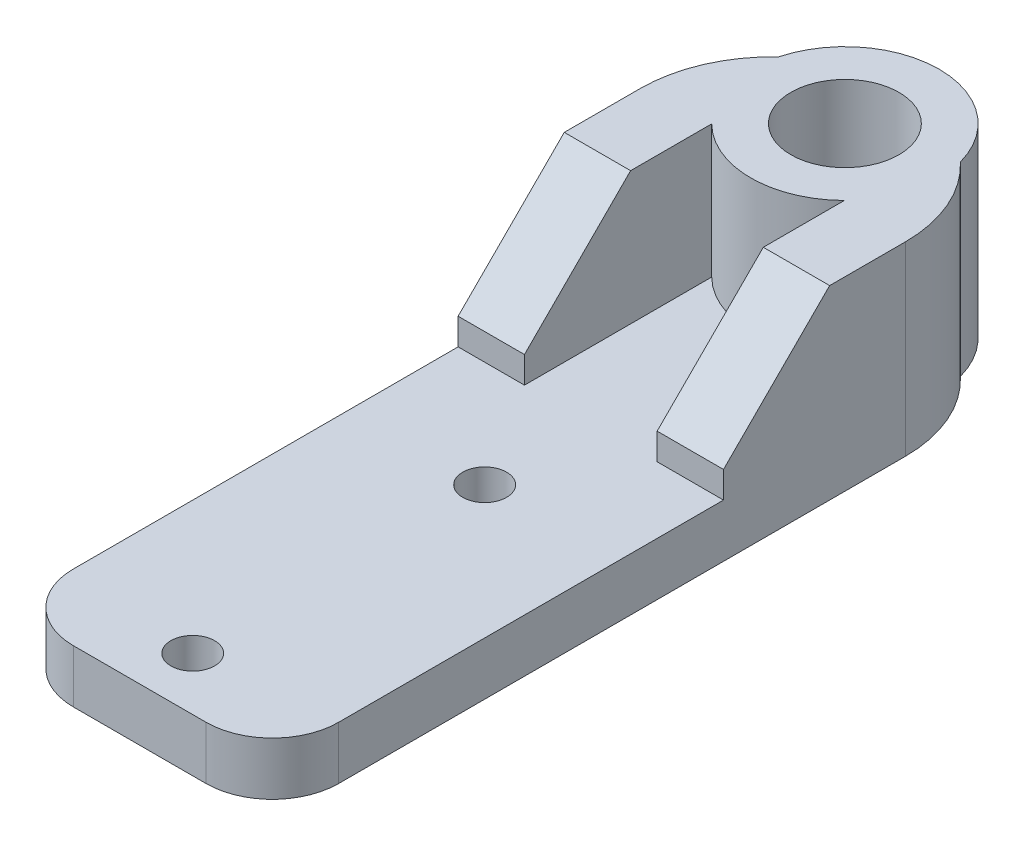
ISO-10303-21;
HEADER;
FILE_DESCRIPTION(('STEP AP214'),'2;1');
FILE_NAME('part.step','',(''),(''),'','','');
FILE_SCHEMA(('AUTOMOTIVE_DESIGN { 1 0 10303 214 1 1 1 1 }'));
ENDSEC;
DATA;
#1=APPLICATION_CONTEXT('core data for automotive mechanical design processes');
#2=APPLICATION_PROTOCOL_DEFINITION('international standard','automotive_design',2000,#1);
#3=PRODUCT_CONTEXT('',#1,'mechanical');
#4=PRODUCT('Part','Part','',(#3));
#5=PRODUCT_RELATED_PRODUCT_CATEGORY('part','',(#4));
#6=PRODUCT_DEFINITION_FORMATION('','',#4);
#7=PRODUCT_DEFINITION_CONTEXT('part definition',#1,'design');
#8=PRODUCT_DEFINITION('design','',#6,#7);
#9=PRODUCT_DEFINITION_SHAPE('','',#8);
#10=(LENGTH_UNIT() NAMED_UNIT(*) SI_UNIT(.MILLI.,.METRE.));
#11=(NAMED_UNIT(*) PLANE_ANGLE_UNIT() SI_UNIT($,.RADIAN.));
#12=(NAMED_UNIT(*) SI_UNIT($,.STERADIAN.) SOLID_ANGLE_UNIT());
#13=UNCERTAINTY_MEASURE_WITH_UNIT(LENGTH_MEASURE(1.E-05),#10,'distance_accuracy_value','');
#14=(GEOMETRIC_REPRESENTATION_CONTEXT(3) GLOBAL_UNCERTAINTY_ASSIGNED_CONTEXT((#13)) GLOBAL_UNIT_ASSIGNED_CONTEXT((#10,
#11,#12)) REPRESENTATION_CONTEXT('',''));
#15=CARTESIAN_POINT('',(0.,0.,0.));
#16=DIRECTION('',(0.,0.,1.));
#17=DIRECTION('',(1.,0.,0.));
#18=AXIS2_PLACEMENT_3D('',#15,#16,#17);
#19=CARTESIAN_POINT('',(0.,4.,0.));
#20=DIRECTION('',(0.,-1.,0.));
#21=DIRECTION('',(0.,0.,-1.));
#22=AXIS2_PLACEMENT_3D('',#19,#20,#21);
#23=PLANE('',#22);
#24=CARTESIAN_POINT('',(0.,4.,23.5));
#25=DIRECTION('',(0.,1.,0.));
#26=DIRECTION('',(0.,0.,1.));
#27=AXIS2_PLACEMENT_3D('',#24,#25,#26);
#28=CIRCLE('',#27,1.65);
#29=CARTESIAN_POINT('',(0.,4.,25.15));
#30=VERTEX_POINT('',#29);
#31=EDGE_CURVE('E334',#30,#30,#28,.T.);
#32=ORIENTED_EDGE('',*,*,#31,.F.);
#33=EDGE_LOOP('',(#32));
#34=FACE_BOUND('',#33,.T.);
#35=CARTESIAN_POINT('',(0.,4.,1.5));
#36=DIRECTION('',(0.,1.,0.));
#37=DIRECTION('',(0.,0.,1.));
#38=AXIS2_PLACEMENT_3D('',#35,#36,#37);
#39=CIRCLE('',#38,1.65);
#40=CARTESIAN_POINT('',(0.,4.,3.15));
#41=VERTEX_POINT('',#40);
#42=EDGE_CURVE('E328',#41,#41,#39,.T.);
#43=ORIENTED_EDGE('',*,*,#42,.F.);
#44=EDGE_LOOP('',(#43));
#45=FACE_BOUND('',#44,.T.);
#46=DIRECTION('',(1.,0.,0.));
#47=VECTOR('',#46,1.);
#48=CARTESIAN_POINT('',(-10.,4.,27.5));
#49=LINE('',#48,#47);
#50=CARTESIAN_POINT('',(-5.,4.,27.5));
#51=VERTEX_POINT('',#50);
#52=CARTESIAN_POINT('',(5.,4.,27.5));
#53=VERTEX_POINT('',#52);
#54=EDGE_CURVE('E205',#51,#53,#49,.T.);
#55=ORIENTED_EDGE('',*,*,#54,.T.);
#56=CARTESIAN_POINT('',(5.,4.,22.5));
#57=DIRECTION('',(0.,-1.,0.));
#58=DIRECTION('',(0.,0.,-1.));
#59=AXIS2_PLACEMENT_3D('',#56,#57,#58);
#60=CIRCLE('',#59,5.);
#61=CARTESIAN_POINT('',(10.,4.,22.5));
#62=VERTEX_POINT('',#61);
#63=EDGE_CURVE('E46',#53,#62,#60,.F.);
#64=ORIENTED_EDGE('',*,*,#63,.T.);
#65=DIRECTION('',(0.,0.,-1.));
#66=VECTOR('',#65,1.);
#67=CARTESIAN_POINT('',(10.,4.,27.5));
#68=LINE('',#67,#66);
#69=CARTESIAN_POINT('',(10.,4.,-6.5));
#70=VERTEX_POINT('',#69);
#71=EDGE_CURVE('E200',#62,#70,#68,.T.);
#72=ORIENTED_EDGE('',*,*,#71,.T.);
#73=DIRECTION('',(-1.,0.,0.));
#74=VECTOR('',#73,1.);
#75=CARTESIAN_POINT('',(0.,4.,-6.5));
#76=LINE('',#75,#74);
#77=CARTESIAN_POINT('',(5.,4.,-6.5));
#78=VERTEX_POINT('',#77);
#79=EDGE_CURVE('E185',#70,#78,#76,.T.);
#80=ORIENTED_EDGE('',*,*,#79,.T.);
#81=DIRECTION('',(0.,0.,1.));
#82=VECTOR('',#81,1.);
#83=CARTESIAN_POINT('',(5.,4.,0.));
#84=LINE('',#83,#82);
#85=CARTESIAN_POINT('',(5.,4.,-20.6091667355486));
#86=VERTEX_POINT('',#85);
#87=EDGE_CURVE('E311',#86,#78,#84,.T.);
#88=ORIENTED_EDGE('',*,*,#87,.F.);
#89=CARTESIAN_POINT('',(0.,4.,-25.65));
#90=DIRECTION('',(0.,-1.,0.));
#91=DIRECTION('',(0.,0.,-1.));
#92=AXIS2_PLACEMENT_3D('',#89,#90,#91);
#93=CIRCLE('',#92,7.1);
#94=CARTESIAN_POINT('',(-5.,4.,-20.6091667355486));
#95=VERTEX_POINT('',#94);
#96=EDGE_CURVE('E191',#86,#95,#93,.T.);
#97=ORIENTED_EDGE('',*,*,#96,.T.);
#98=DIRECTION('',(0.,0.,-1.));
#99=VECTOR('',#98,1.);
#100=CARTESIAN_POINT('',(-5.,4.,0.));
#101=LINE('',#100,#99);
#102=CARTESIAN_POINT('',(-5.,4.,-6.5));
#103=VERTEX_POINT('',#102);
#104=EDGE_CURVE('E159',#103,#95,#101,.T.);
#105=ORIENTED_EDGE('',*,*,#104,.F.);
#106=DIRECTION('',(1.,0.,0.));
#107=VECTOR('',#106,1.);
#108=CARTESIAN_POINT('',(0.,4.,-6.5));
#109=LINE('',#108,#107);
#110=CARTESIAN_POINT('',(-10.,4.,-6.5));
#111=VERTEX_POINT('',#110);
#112=EDGE_CURVE('E300',#111,#103,#109,.T.);
#113=ORIENTED_EDGE('',*,*,#112,.F.);
#114=DIRECTION('',(0.,0.,1.));
#115=VECTOR('',#114,1.);
#116=CARTESIAN_POINT('',(-10.,4.,27.5));
#117=LINE('',#116,#115);
#118=CARTESIAN_POINT('',(-10.,4.,22.5));
#119=VERTEX_POINT('',#118);
#120=EDGE_CURVE('E202',#111,#119,#117,.T.);
#121=ORIENTED_EDGE('',*,*,#120,.T.);
#122=CARTESIAN_POINT('',(-5.,4.,22.5));
#123=DIRECTION('',(0.,-1.,0.));
#124=DIRECTION('',(0.,0.,-1.));
#125=AXIS2_PLACEMENT_3D('',#122,#123,#124);
#126=CIRCLE('',#125,5.);
#127=EDGE_CURVE('E257',#119,#51,#126,.F.);
#128=ORIENTED_EDGE('',*,*,#127,.T.);
#129=EDGE_LOOP('',(#55,#64,#72,#80,#88,#97,#105,#113,#121,#128));
#130=FACE_BOUND('',#129,.T.);
#131=ADVANCED_FACE('F38',(#34,#45,#130),#23,.F.);
#132=CARTESIAN_POINT('',(0.,-20.081832585698,-25.65));
#133=DIRECTION('',(0.,1.,0.));
#134=DIRECTION('',(0.,0.,1.));
#135=AXIS2_PLACEMENT_3D('',#132,#133,#134);
#136=CYLINDRICAL_SURFACE('',#135,7.1);
#137=DIRECTION('',(0.,1.,0.));
#138=VECTOR('',#137,1.);
#139=CARTESIAN_POINT('',(-6.85474288358068,-20.081832585698,-27.5));
#140=LINE('',#139,#138);
#141=CARTESIAN_POINT('',(-6.85474288358068,14.,-27.5));
#142=VERTEX_POINT('',#141);
#143=CARTESIAN_POINT('',(-6.85474288358068,0.,-27.5));
#144=VERTEX_POINT('',#143);
#145=EDGE_CURVE('E193',#142,#144,#140,.F.);
#146=ORIENTED_EDGE('',*,*,#145,.F.);
#147=CARTESIAN_POINT('',(0.,14.,-25.65));
#148=DIRECTION('',(0.,1.,0.));
#149=DIRECTION('',(0.,0.,1.));
#150=AXIS2_PLACEMENT_3D('',#147,#148,#149);
#151=CIRCLE('',#150,7.1);
#152=CARTESIAN_POINT('',(6.85474288358068,14.,-27.5));
#153=VERTEX_POINT('',#152);
#154=EDGE_CURVE('E179',#153,#142,#151,.T.);
#155=ORIENTED_EDGE('',*,*,#154,.F.);
#156=DIRECTION('',(0.,1.,0.));
#157=VECTOR('',#156,1.);
#158=CARTESIAN_POINT('',(6.85474288358068,-20.081832585698,-27.5));
#159=LINE('',#158,#157);
#160=CARTESIAN_POINT('',(6.85474288358068,0.,-27.5));
#161=VERTEX_POINT('',#160);
#162=EDGE_CURVE('E196',#161,#153,#159,.T.);
#163=ORIENTED_EDGE('',*,*,#162,.F.);
#164=CARTESIAN_POINT('',(0.,0.,-25.65));
#165=DIRECTION('',(0.,-1.,0.));
#166=DIRECTION('',(0.,0.,-1.));
#167=AXIS2_PLACEMENT_3D('',#164,#165,#166);
#168=CIRCLE('',#167,7.1);
#169=EDGE_CURVE('E183',#161,#144,#168,.F.);
#170=ORIENTED_EDGE('',*,*,#169,.T.);
#171=EDGE_LOOP('',(#146,#155,#163,#170));
#172=FACE_BOUND('',#171,.T.);
#173=ADVANCED_FACE('F291',(#172),#136,.T.);
#174=CARTESIAN_POINT('',(-5.,14.,-20.6091667355486));
#175=VERTEX_POINT('',#174);
#176=CARTESIAN_POINT('',(5.,14.,-20.6091667355486));
#177=VERTEX_POINT('',#176);
#178=EDGE_CURVE('E170',#175,#177,#151,.T.);
#179=ORIENTED_EDGE('',*,*,#178,.F.);
#180=DIRECTION('',(0.,1.,0.));
#181=VECTOR('',#180,1.);
#182=CARTESIAN_POINT('',(-5.,-20.081832585698,-20.6091667355486));
#183=LINE('',#182,#181);
#184=EDGE_CURVE('E153',#175,#95,#183,.F.);
#185=ORIENTED_EDGE('',*,*,#184,.T.);
#186=ORIENTED_EDGE('',*,*,#96,.F.);
#187=DIRECTION('',(0.,1.,0.));
#188=VECTOR('',#187,1.);
#189=CARTESIAN_POINT('',(5.,-20.081832585698,-20.6091667355486));
#190=LINE('',#189,#188);
#191=EDGE_CURVE('E178',#86,#177,#190,.T.);
#192=ORIENTED_EDGE('',*,*,#191,.T.);
#193=EDGE_LOOP('',(#179,#185,#186,#192));
#194=FACE_BOUND('',#193,.T.);
#195=ADVANCED_FACE('F177',(#194),#136,.T.);
#196=CARTESIAN_POINT('',(10.,4.,27.5));
#197=DIRECTION('',(-1.,0.,0.));
#198=DIRECTION('',(0.,0.,1.));
#199=AXIS2_PLACEMENT_3D('',#196,#197,#198);
#200=PLANE('',#199);
#201=ORIENTED_EDGE('',*,*,#71,.F.);
#202=DIRECTION('',(0.,-1.,0.));
#203=VECTOR('',#202,1.);
#204=CARTESIAN_POINT('',(10.,4.,22.5));
#205=LINE('',#204,#203);
#206=CARTESIAN_POINT('',(10.,0.,22.5));
#207=VERTEX_POINT('',#206);
#208=EDGE_CURVE('E246',#62,#207,#205,.T.);
#209=ORIENTED_EDGE('',*,*,#208,.T.);
#210=DIRECTION('',(0.,0.,-1.));
#211=VECTOR('',#210,1.);
#212=CARTESIAN_POINT('',(10.,0.,27.5));
#213=LINE('',#212,#211);
#214=CARTESIAN_POINT('',(10.,0.,-20.2190316578081));
#215=VERTEX_POINT('',#214);
#216=EDGE_CURVE('E199',#207,#215,#213,.T.);
#217=ORIENTED_EDGE('',*,*,#216,.T.);
#218=DIRECTION('',(0.,1.,0.));
#219=VECTOR('',#218,1.);
#220=CARTESIAN_POINT('',(10.,4.,-20.2190316578081));
#221=LINE('',#220,#219);
#222=CARTESIAN_POINT('',(9.99999999999999,14.,-20.2190316578081));
#223=VERTEX_POINT('',#222);
#224=EDGE_CURVE('E237',#215,#223,#221,.T.);
#225=ORIENTED_EDGE('',*,*,#224,.T.);
#226=DIRECTION('',(0.,0.,1.));
#227=VECTOR('',#226,1.);
#228=CARTESIAN_POINT('',(10.,14.,-27.5));
#229=LINE('',#228,#227);
#230=CARTESIAN_POINT('',(10.,14.,-14.5));
#231=VERTEX_POINT('',#230);
#232=EDGE_CURVE('E297',#223,#231,#229,.T.);
#233=ORIENTED_EDGE('',*,*,#232,.T.);
#234=DIRECTION('',(0.,0.707106781186549,-0.707106781186546));
#235=VECTOR('',#234,1.);
#236=CARTESIAN_POINT('',(10.,14.,-14.5));
#237=LINE('',#236,#235);
#238=CARTESIAN_POINT('',(10.,5.99999999999997,-6.5));
#239=VERTEX_POINT('',#238);
#240=EDGE_CURVE('E217',#231,#239,#237,.F.);
#241=ORIENTED_EDGE('',*,*,#240,.T.);
#242=DIRECTION('',(0.,-1.,0.));
#243=VECTOR('',#242,1.);
#244=CARTESIAN_POINT('',(10.,0.,-6.5));
#245=LINE('',#244,#243);
#246=EDGE_CURVE('E269',#239,#70,#245,.T.);
#247=ORIENTED_EDGE('',*,*,#246,.T.);
#248=EDGE_LOOP('',(#201,#209,#217,#225,#233,#241,#247));
#249=FACE_BOUND('',#248,.T.);
#250=ADVANCED_FACE('F266',(#249),#200,.F.);
#251=CARTESIAN_POINT('',(-10.,4.,27.5));
#252=DIRECTION('',(1.,0.,0.));
#253=DIRECTION('',(0.,0.,-1.));
#254=AXIS2_PLACEMENT_3D('',#251,#252,#253);
#255=PLANE('',#254);
#256=DIRECTION('',(0.,0.,1.));
#257=VECTOR('',#256,1.);
#258=CARTESIAN_POINT('',(-10.,0.,27.5));
#259=LINE('',#258,#257);
#260=CARTESIAN_POINT('',(-10.,0.,-20.2190316578081));
#261=VERTEX_POINT('',#260);
#262=CARTESIAN_POINT('',(-10.,0.,22.5));
#263=VERTEX_POINT('',#262);
#264=EDGE_CURVE('E209',#261,#263,#259,.T.);
#265=ORIENTED_EDGE('',*,*,#264,.T.);
#266=DIRECTION('',(0.,-1.,0.));
#267=VECTOR('',#266,1.);
#268=CARTESIAN_POINT('',(-10.,4.,22.5));
#269=LINE('',#268,#267);
#270=EDGE_CURVE('E11',#263,#119,#269,.F.);
#271=ORIENTED_EDGE('',*,*,#270,.T.);
#272=ORIENTED_EDGE('',*,*,#120,.F.);
#273=DIRECTION('',(0.,-1.,0.));
#274=VECTOR('',#273,1.);
#275=CARTESIAN_POINT('',(-10.,0.,-6.5));
#276=LINE('',#275,#274);
#277=CARTESIAN_POINT('',(-10.,5.99999999999997,-6.5));
#278=VERTEX_POINT('',#277);
#279=EDGE_CURVE('E324',#278,#111,#276,.T.);
#280=ORIENTED_EDGE('',*,*,#279,.F.);
#281=DIRECTION('',(0.,0.707106781186549,-0.707106781186546));
#282=VECTOR('',#281,1.);
#283=CARTESIAN_POINT('',(-10.,5.99999999999997,-6.5));
#284=LINE('',#283,#282);
#285=CARTESIAN_POINT('',(-10.,14.,-14.5));
#286=VERTEX_POINT('',#285);
#287=EDGE_CURVE('E226',#278,#286,#284,.T.);
#288=ORIENTED_EDGE('',*,*,#287,.T.);
#289=DIRECTION('',(0.,0.,1.));
#290=VECTOR('',#289,1.);
#291=CARTESIAN_POINT('',(-10.,14.,-27.5));
#292=LINE('',#291,#290);
#293=CARTESIAN_POINT('',(-9.99999999999999,14.,-20.2190316578081));
#294=VERTEX_POINT('',#293);
#295=EDGE_CURVE('E284',#294,#286,#292,.T.);
#296=ORIENTED_EDGE('',*,*,#295,.F.);
#297=DIRECTION('',(0.,1.,0.));
#298=VECTOR('',#297,1.);
#299=CARTESIAN_POINT('',(-10.,4.,-20.2190316578081));
#300=LINE('',#299,#298);
#301=EDGE_CURVE('E243',#294,#261,#300,.F.);
#302=ORIENTED_EDGE('',*,*,#301,.T.);
#303=EDGE_LOOP('',(#265,#271,#272,#280,#288,#296,#302));
#304=FACE_BOUND('',#303,.T.);
#305=ADVANCED_FACE('F281',(#304),#255,.F.);
#306=CARTESIAN_POINT('',(-10.,4.,27.5));
#307=DIRECTION('',(0.,0.,-1.));
#308=DIRECTION('',(-1.,0.,0.));
#309=AXIS2_PLACEMENT_3D('',#306,#307,#308);
#310=PLANE('',#309);
#311=DIRECTION('',(1.,0.,0.));
#312=VECTOR('',#311,1.);
#313=CARTESIAN_POINT('',(-10.,0.,27.5));
#314=LINE('',#313,#312);
#315=CARTESIAN_POINT('',(-5.,0.,27.5));
#316=VERTEX_POINT('',#315);
#317=CARTESIAN_POINT('',(5.,0.,27.5));
#318=VERTEX_POINT('',#317);
#319=EDGE_CURVE('E203',#316,#318,#314,.T.);
#320=ORIENTED_EDGE('',*,*,#319,.T.);
#321=DIRECTION('',(0.,-1.,0.));
#322=VECTOR('',#321,1.);
#323=CARTESIAN_POINT('',(5.,4.,27.5));
#324=LINE('',#323,#322);
#325=EDGE_CURVE('E59',#318,#53,#324,.F.);
#326=ORIENTED_EDGE('',*,*,#325,.T.);
#327=ORIENTED_EDGE('',*,*,#54,.F.);
#328=DIRECTION('',(0.,-1.,0.));
#329=VECTOR('',#328,1.);
#330=CARTESIAN_POINT('',(-5.,4.,27.5));
#331=LINE('',#330,#329);
#332=EDGE_CURVE('E253',#51,#316,#331,.T.);
#333=ORIENTED_EDGE('',*,*,#332,.T.);
#334=EDGE_LOOP('',(#320,#326,#327,#333));
#335=FACE_BOUND('',#334,.T.);
#336=ADVANCED_FACE('F276',(#335),#310,.F.);
#337=CARTESIAN_POINT('',(0.,0.,0.));
#338=DIRECTION('',(0.,-1.,0.));
#339=DIRECTION('',(0.,0.,-1.));
#340=AXIS2_PLACEMENT_3D('',#337,#338,#339);
#341=PLANE('',#340);
#342=CARTESIAN_POINT('',(0.,0.,23.5));
#343=DIRECTION('',(0.,1.,0.));
#344=DIRECTION('',(0.,0.,1.));
#345=AXIS2_PLACEMENT_3D('',#342,#343,#344);
#346=CIRCLE('',#345,1.65);
#347=CARTESIAN_POINT('',(0.,0.,25.15));
#348=VERTEX_POINT('',#347);
#349=EDGE_CURVE('E325',#348,#348,#346,.T.);
#350=ORIENTED_EDGE('',*,*,#349,.T.);
#351=EDGE_LOOP('',(#350));
#352=FACE_BOUND('',#351,.T.);
#353=CARTESIAN_POINT('',(0.,0.,1.5));
#354=DIRECTION('',(0.,1.,0.));
#355=DIRECTION('',(0.,0.,1.));
#356=AXIS2_PLACEMENT_3D('',#353,#354,#355);
#357=CIRCLE('',#356,1.65);
#358=CARTESIAN_POINT('',(0.,0.,3.15));
#359=VERTEX_POINT('',#358);
#360=EDGE_CURVE('E331',#359,#359,#357,.T.);
#361=ORIENTED_EDGE('',*,*,#360,.T.);
#362=EDGE_LOOP('',(#361));
#363=FACE_BOUND('',#362,.T.);
#364=ORIENTED_EDGE('',*,*,#216,.F.);
#365=CARTESIAN_POINT('',(5.,0.,22.5));
#366=DIRECTION('',(0.,-1.,0.));
#367=DIRECTION('',(0.,0.,-1.));
#368=AXIS2_PLACEMENT_3D('',#365,#366,#367);
#369=CIRCLE('',#368,5.);
#370=EDGE_CURVE('E251',#207,#318,#369,.T.);
#371=ORIENTED_EDGE('',*,*,#370,.T.);
#372=ORIENTED_EDGE('',*,*,#319,.F.);
#373=CARTESIAN_POINT('',(-5.,0.,22.5));
#374=DIRECTION('',(0.,-1.,0.));
#375=DIRECTION('',(0.,0.,-1.));
#376=AXIS2_PLACEMENT_3D('',#373,#374,#375);
#377=CIRCLE('',#376,5.);
#378=EDGE_CURVE('E249',#316,#263,#377,.T.);
#379=ORIENTED_EDGE('',*,*,#378,.T.);
#380=ORIENTED_EDGE('',*,*,#264,.F.);
#381=CARTESIAN_POINT('',(0.,0.,-20.2190316578081));
#382=DIRECTION('',(0.,-1.,0.));
#383=DIRECTION('',(0.,0.,-1.));
#384=AXIS2_PLACEMENT_3D('',#381,#382,#383);
#385=CIRCLE('',#384,10.);
#386=EDGE_CURVE('E232',#261,#144,#385,.T.);
#387=ORIENTED_EDGE('',*,*,#386,.T.);
#388=ORIENTED_EDGE('',*,*,#169,.F.);
#389=CARTESIAN_POINT('',(0.,0.,-20.2190316578081));
#390=DIRECTION('',(0.,-1.,0.));
#391=DIRECTION('',(0.,0.,-1.));
#392=AXIS2_PLACEMENT_3D('',#389,#390,#391);
#393=CIRCLE('',#392,10.);
#394=EDGE_CURVE('E234',#161,#215,#393,.T.);
#395=ORIENTED_EDGE('',*,*,#394,.T.);
#396=EDGE_LOOP('',(#364,#371,#372,#379,#380,#387,#388,#395));
#397=FACE_BOUND('',#396,.T.);
#398=CARTESIAN_POINT('',(0.,0.,-25.65));
#399=DIRECTION('',(0.,-1.,0.));
#400=DIRECTION('',(0.,0.,-1.));
#401=AXIS2_PLACEMENT_3D('',#398,#399,#400);
#402=CIRCLE('',#401,4.075);
#403=CARTESIAN_POINT('',(0.,0.,-29.725));
#404=VERTEX_POINT('',#403);
#405=EDGE_CURVE('E207',#404,#404,#402,.T.);
#406=ORIENTED_EDGE('',*,*,#405,.F.);
#407=EDGE_LOOP('',(#406));
#408=FACE_BOUND('',#407,.T.);
#409=ADVANCED_FACE('F274',(#352,#363,#397,#408),#341,.T.);
#410=CARTESIAN_POINT('',(0.,0.,-25.65));
#411=DIRECTION('',(0.,1.,0.));
#412=DIRECTION('',(0.,0.,1.));
#413=AXIS2_PLACEMENT_3D('',#410,#411,#412);
#414=CYLINDRICAL_SURFACE('',#413,4.075);
#415=ORIENTED_EDGE('',*,*,#405,.T.);
#416=EDGE_LOOP('',(#415));
#417=FACE_BOUND('',#416,.T.);
#418=CARTESIAN_POINT('',(0.,14.,-25.65));
#419=DIRECTION('',(0.,1.,0.));
#420=DIRECTION('',(0.,0.,1.));
#421=AXIS2_PLACEMENT_3D('',#418,#419,#420);
#422=CIRCLE('',#421,4.075);
#423=CARTESIAN_POINT('',(0.,14.,-21.575));
#424=VERTEX_POINT('',#423);
#425=EDGE_CURVE('E180',#424,#424,#422,.T.);
#426=ORIENTED_EDGE('',*,*,#425,.T.);
#427=EDGE_LOOP('',(#426));
#428=FACE_BOUND('',#427,.T.);
#429=ADVANCED_FACE('F376',(#417,#428),#414,.F.);
#430=CARTESIAN_POINT('',(0.,14.,-25.65));
#431=DIRECTION('',(0.,1.,0.));
#432=DIRECTION('',(0.,0.,1.));
#433=AXIS2_PLACEMENT_3D('',#430,#431,#432);
#434=PLANE('',#433);
#435=ORIENTED_EDGE('',*,*,#232,.F.);
#436=CARTESIAN_POINT('',(0.,14.,-20.2190316578081));
#437=DIRECTION('',(0.,1.,0.));
#438=DIRECTION('',(0.,0.,1.));
#439=AXIS2_PLACEMENT_3D('',#436,#437,#438);
#440=CIRCLE('',#439,10.);
#441=EDGE_CURVE('E241',#223,#153,#440,.T.);
#442=ORIENTED_EDGE('',*,*,#441,.T.);
#443=ORIENTED_EDGE('',*,*,#154,.T.);
#444=CARTESIAN_POINT('',(0.,14.,-20.2190316578081));
#445=DIRECTION('',(0.,1.,0.));
#446=DIRECTION('',(0.,0.,1.));
#447=AXIS2_PLACEMENT_3D('',#444,#445,#446);
#448=CIRCLE('',#447,10.);
#449=EDGE_CURVE('E239',#142,#294,#448,.T.);
#450=ORIENTED_EDGE('',*,*,#449,.T.);
#451=ORIENTED_EDGE('',*,*,#295,.T.);
#452=DIRECTION('',(1.,0.,0.));
#453=VECTOR('',#452,1.);
#454=CARTESIAN_POINT('',(-5.,14.,-14.5));
#455=LINE('',#454,#453);
#456=CARTESIAN_POINT('',(-5.,14.,-14.5));
#457=VERTEX_POINT('',#456);
#458=EDGE_CURVE('E173',#286,#457,#455,.T.);
#459=ORIENTED_EDGE('',*,*,#458,.T.);
#460=DIRECTION('',(0.,0.,1.));
#461=VECTOR('',#460,1.);
#462=CARTESIAN_POINT('',(-5.,14.,-27.5));
#463=LINE('',#462,#461);
#464=EDGE_CURVE('E156',#175,#457,#463,.T.);
#465=ORIENTED_EDGE('',*,*,#464,.F.);
#466=ORIENTED_EDGE('',*,*,#178,.T.);
#467=DIRECTION('',(0.,0.,1.));
#468=VECTOR('',#467,1.);
#469=CARTESIAN_POINT('',(5.,14.,-27.5));
#470=LINE('',#469,#468);
#471=CARTESIAN_POINT('',(5.,14.,-14.5));
#472=VERTEX_POINT('',#471);
#473=EDGE_CURVE('E302',#177,#472,#470,.T.);
#474=ORIENTED_EDGE('',*,*,#473,.T.);
#475=DIRECTION('',(1.,0.,0.));
#476=VECTOR('',#475,1.);
#477=CARTESIAN_POINT('',(0.,14.,-14.5));
#478=LINE('',#477,#476);
#479=EDGE_CURVE('E214',#472,#231,#478,.T.);
#480=ORIENTED_EDGE('',*,*,#479,.T.);
#481=EDGE_LOOP('',(#435,#442,#443,#450,#451,#459,#465,#466,#474,#480));
#482=FACE_BOUND('',#481,.T.);
#483=ORIENTED_EDGE('',*,*,#425,.F.);
#484=EDGE_LOOP('',(#483));
#485=FACE_BOUND('',#484,.T.);
#486=ADVANCED_FACE('F167',(#482,#485),#434,.T.);
#487=CARTESIAN_POINT('',(5.,0.,-6.5));
#488=DIRECTION('',(0.,0.,1.));
#489=DIRECTION('',(1.,0.,0.));
#490=AXIS2_PLACEMENT_3D('',#487,#488,#489);
#491=PLANE('',#490);
#492=ORIENTED_EDGE('',*,*,#246,.F.);
#493=DIRECTION('',(-1.,0.,0.));
#494=VECTOR('',#493,1.);
#495=CARTESIAN_POINT('',(5.,5.99999999999997,-6.5));
#496=LINE('',#495,#494);
#497=CARTESIAN_POINT('',(5.,5.99999999999997,-6.5));
#498=VERTEX_POINT('',#497);
#499=EDGE_CURVE('E219',#239,#498,#496,.T.);
#500=ORIENTED_EDGE('',*,*,#499,.T.);
#501=DIRECTION('',(0.,-1.,0.));
#502=VECTOR('',#501,1.);
#503=CARTESIAN_POINT('',(5.,0.,-6.5));
#504=LINE('',#503,#502);
#505=EDGE_CURVE('E307',#498,#78,#504,.T.);
#506=ORIENTED_EDGE('',*,*,#505,.T.);
#507=ORIENTED_EDGE('',*,*,#79,.F.);
#508=EDGE_LOOP('',(#492,#500,#506,#507));
#509=FACE_BOUND('',#508,.T.);
#510=ADVANCED_FACE('F315',(#509),#491,.T.);
#511=CARTESIAN_POINT('',(5.,0.,0.));
#512=DIRECTION('',(1.,0.,0.));
#513=DIRECTION('',(0.,0.,-1.));
#514=AXIS2_PLACEMENT_3D('',#511,#512,#513);
#515=PLANE('',#514);
#516=ORIENTED_EDGE('',*,*,#505,.F.);
#517=DIRECTION('',(0.,-0.707106781186549,0.707106781186546));
#518=VECTOR('',#517,1.);
#519=CARTESIAN_POINT('',(5.,14.,-14.5));
#520=LINE('',#519,#518);
#521=EDGE_CURVE('E221',#498,#472,#520,.F.);
#522=ORIENTED_EDGE('',*,*,#521,.T.);
#523=ORIENTED_EDGE('',*,*,#473,.F.);
#524=ORIENTED_EDGE('',*,*,#191,.F.);
#525=ORIENTED_EDGE('',*,*,#87,.T.);
#526=EDGE_LOOP('',(#516,#522,#523,#524,#525));
#527=FACE_BOUND('',#526,.T.);
#528=ADVANCED_FACE('F320',(#527),#515,.F.);
#529=CARTESIAN_POINT('',(0.,14.,-14.5));
#530=DIRECTION('',(0.,-0.707106781186546,-0.707106781186549));
#531=DIRECTION('',(1.,0.,0.));
#532=AXIS2_PLACEMENT_3D('',#529,#530,#531);
#533=PLANE('',#532);
#534=ORIENTED_EDGE('',*,*,#521,.F.);
#535=ORIENTED_EDGE('',*,*,#499,.F.);
#536=ORIENTED_EDGE('',*,*,#240,.F.);
#537=ORIENTED_EDGE('',*,*,#479,.F.);
#538=EDGE_LOOP('',(#534,#535,#536,#537));
#539=FACE_BOUND('',#538,.T.);
#540=ADVANCED_FACE('F368',(#539),#533,.F.);
#541=CARTESIAN_POINT('',(-5.,0.,-6.5));
#542=DIRECTION('',(0.,0.,-1.));
#543=DIRECTION('',(-1.,0.,0.));
#544=AXIS2_PLACEMENT_3D('',#541,#542,#543);
#545=PLANE('',#544);
#546=DIRECTION('',(0.,-1.,0.));
#547=VECTOR('',#546,1.);
#548=CARTESIAN_POINT('',(-5.,0.,-6.5));
#549=LINE('',#548,#547);
#550=CARTESIAN_POINT('',(-5.,5.99999999999997,-6.5));
#551=VERTEX_POINT('',#550);
#552=EDGE_CURVE('E174',#551,#103,#549,.T.);
#553=ORIENTED_EDGE('',*,*,#552,.F.);
#554=DIRECTION('',(-1.,0.,0.));
#555=VECTOR('',#554,1.);
#556=CARTESIAN_POINT('',(-10.,5.99999999999997,-6.5));
#557=LINE('',#556,#555);
#558=EDGE_CURVE('E223',#551,#278,#557,.T.);
#559=ORIENTED_EDGE('',*,*,#558,.T.);
#560=ORIENTED_EDGE('',*,*,#279,.T.);
#561=ORIENTED_EDGE('',*,*,#112,.T.);
#562=EDGE_LOOP('',(#553,#559,#560,#561));
#563=FACE_BOUND('',#562,.T.);
#564=ADVANCED_FACE('F365',(#563),#545,.F.);
#565=CARTESIAN_POINT('',(-5.,0.,0.));
#566=DIRECTION('',(-1.,0.,0.));
#567=DIRECTION('',(0.,0.,-1.));
#568=AXIS2_PLACEMENT_3D('',#565,#566,#567);
#569=PLANE('',#568);
#570=ORIENTED_EDGE('',*,*,#464,.T.);
#571=DIRECTION('',(0.,-0.707106781186549,0.707106781186546));
#572=VECTOR('',#571,1.);
#573=CARTESIAN_POINT('',(-5.,5.99999999999997,-6.5));
#574=LINE('',#573,#572);
#575=EDGE_CURVE('E230',#457,#551,#574,.T.);
#576=ORIENTED_EDGE('',*,*,#575,.T.);
#577=ORIENTED_EDGE('',*,*,#552,.T.);
#578=ORIENTED_EDGE('',*,*,#104,.T.);
#579=ORIENTED_EDGE('',*,*,#184,.F.);
#580=EDGE_LOOP('',(#570,#576,#577,#578,#579));
#581=FACE_BOUND('',#580,.T.);
#582=ADVANCED_FACE('F155',(#581),#569,.F.);
#583=CARTESIAN_POINT('',(-5.,5.99999999999997,-6.5));
#584=DIRECTION('',(0.,0.707106781186546,0.707106781186549));
#585=DIRECTION('',(1.,0.,0.));
#586=AXIS2_PLACEMENT_3D('',#583,#584,#585);
#587=PLANE('',#586);
#588=ORIENTED_EDGE('',*,*,#575,.F.);
#589=ORIENTED_EDGE('',*,*,#458,.F.);
#590=ORIENTED_EDGE('',*,*,#287,.F.);
#591=ORIENTED_EDGE('',*,*,#558,.F.);
#592=EDGE_LOOP('',(#588,#589,#590,#591));
#593=FACE_BOUND('',#592,.T.);
#594=ADVANCED_FACE('F364',(#593),#587,.T.);
#595=CARTESIAN_POINT('',(0.,-20.081832585698,-20.2190316578081));
#596=DIRECTION('',(0.,1.,0.));
#597=DIRECTION('',(0.,0.,1.));
#598=AXIS2_PLACEMENT_3D('',#595,#596,#597);
#599=CYLINDRICAL_SURFACE('',#598,10.);
#600=ORIENTED_EDGE('',*,*,#441,.F.);
#601=ORIENTED_EDGE('',*,*,#224,.F.);
#602=ORIENTED_EDGE('',*,*,#394,.F.);
#603=ORIENTED_EDGE('',*,*,#162,.T.);
#604=EDGE_LOOP('',(#600,#601,#602,#603));
#605=FACE_BOUND('',#604,.T.);
#606=ADVANCED_FACE('F295',(#605),#599,.T.);
#607=CARTESIAN_POINT('',(0.,-20.081832585698,-20.2190316578081));
#608=DIRECTION('',(0.,1.,0.));
#609=DIRECTION('',(0.,0.,1.));
#610=AXIS2_PLACEMENT_3D('',#607,#608,#609);
#611=CYLINDRICAL_SURFACE('',#610,10.);
#612=ORIENTED_EDGE('',*,*,#449,.F.);
#613=ORIENTED_EDGE('',*,*,#145,.T.);
#614=ORIENTED_EDGE('',*,*,#386,.F.);
#615=ORIENTED_EDGE('',*,*,#301,.F.);
#616=EDGE_LOOP('',(#612,#613,#614,#615));
#617=FACE_BOUND('',#616,.T.);
#618=ADVANCED_FACE('F287',(#617),#611,.T.);
#619=CARTESIAN_POINT('',(5.,4.,22.5));
#620=DIRECTION('',(0.,-1.,0.));
#621=DIRECTION('',(0.,0.,-1.));
#622=AXIS2_PLACEMENT_3D('',#619,#620,#621);
#623=CYLINDRICAL_SURFACE('',#622,5.);
#624=ORIENTED_EDGE('',*,*,#63,.F.);
#625=ORIENTED_EDGE('',*,*,#325,.F.);
#626=ORIENTED_EDGE('',*,*,#370,.F.);
#627=ORIENTED_EDGE('',*,*,#208,.F.);
#628=EDGE_LOOP('',(#624,#625,#626,#627));
#629=FACE_BOUND('',#628,.T.);
#630=ADVANCED_FACE('F271',(#629),#623,.T.);
#631=CARTESIAN_POINT('',(-5.,4.,22.5));
#632=DIRECTION('',(0.,-1.,0.));
#633=DIRECTION('',(0.,0.,-1.));
#634=AXIS2_PLACEMENT_3D('',#631,#632,#633);
#635=CYLINDRICAL_SURFACE('',#634,5.);
#636=ORIENTED_EDGE('',*,*,#127,.F.);
#637=ORIENTED_EDGE('',*,*,#270,.F.);
#638=ORIENTED_EDGE('',*,*,#378,.F.);
#639=ORIENTED_EDGE('',*,*,#332,.F.);
#640=EDGE_LOOP('',(#636,#637,#638,#639));
#641=FACE_BOUND('',#640,.T.);
#642=ADVANCED_FACE('F40',(#641),#635,.T.);
#643=CARTESIAN_POINT('',(0.,0.,1.5));
#644=DIRECTION('',(0.,1.,0.));
#645=DIRECTION('',(0.,0.,1.));
#646=AXIS2_PLACEMENT_3D('',#643,#644,#645);
#647=CYLINDRICAL_SURFACE('',#646,1.65);
#648=ORIENTED_EDGE('',*,*,#360,.F.);
#649=EDGE_LOOP('',(#648));
#650=FACE_BOUND('',#649,.T.);
#651=ORIENTED_EDGE('',*,*,#42,.T.);
#652=EDGE_LOOP('',(#651));
#653=FACE_BOUND('',#652,.T.);
#654=ADVANCED_FACE('F345',(#650,#653),#647,.F.);
#655=CARTESIAN_POINT('',(0.,0.,23.5));
#656=DIRECTION('',(0.,1.,0.));
#657=DIRECTION('',(0.,0.,1.));
#658=AXIS2_PLACEMENT_3D('',#655,#656,#657);
#659=CYLINDRICAL_SURFACE('',#658,1.65);
#660=ORIENTED_EDGE('',*,*,#349,.F.);
#661=EDGE_LOOP('',(#660));
#662=FACE_BOUND('',#661,.T.);
#663=ORIENTED_EDGE('',*,*,#31,.T.);
#664=EDGE_LOOP('',(#663));
#665=FACE_BOUND('',#664,.T.);
#666=ADVANCED_FACE('F342',(#662,#665),#659,.F.);
#667=CLOSED_SHELL('',(#131,#173,#195,#250,#305,#336,#409,#429,#486,#510,#528,#540,#564,#582,
#594,#606,#618,#630,#642,#654,#666));
#668=MANIFOLD_SOLID_BREP('B2',#667);
#669=ADVANCED_BREP_SHAPE_REPRESENTATION('',(#18,#668),#14);
#670=SHAPE_DEFINITION_REPRESENTATION(#9,#669);
ENDSEC;
END-ISO-10303-21;
